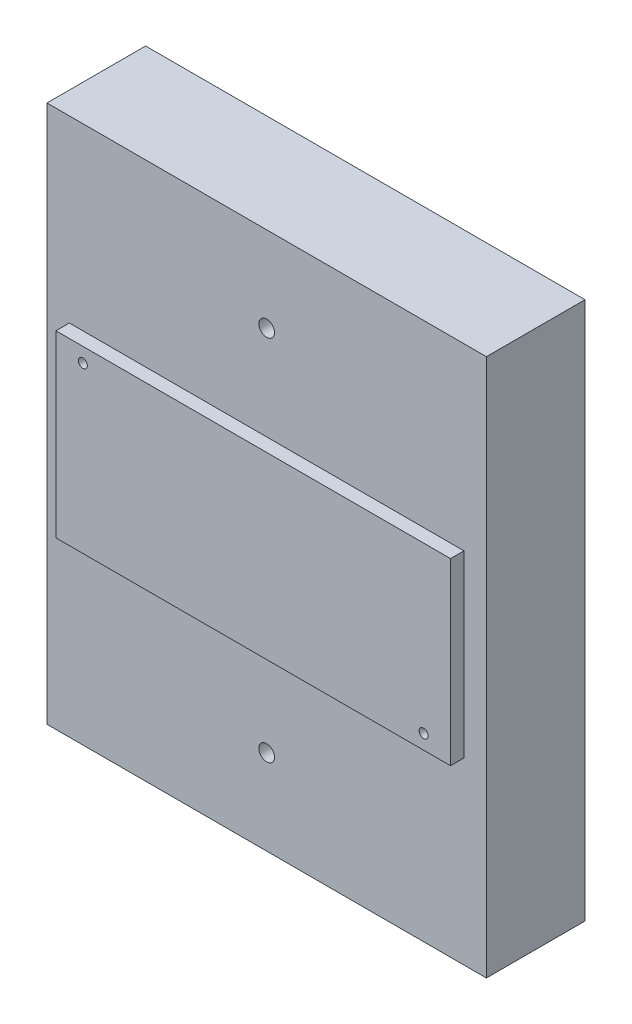
ISO-10303-21;
HEADER;
FILE_DESCRIPTION(('STEP AP214'),'2;1');
FILE_NAME('part.step','',(''),(''),'','','');
FILE_SCHEMA(('AUTOMOTIVE_DESIGN { 1 0 10303 214 1 1 1 1 }'));
ENDSEC;
DATA;
#1=APPLICATION_CONTEXT('core data for automotive mechanical design processes');
#2=APPLICATION_PROTOCOL_DEFINITION('international standard','automotive_design',2000,#1);
#3=PRODUCT_CONTEXT('',#1,'mechanical');
#4=PRODUCT('Part','Part','',(#3));
#5=PRODUCT_RELATED_PRODUCT_CATEGORY('part','',(#4));
#6=PRODUCT_DEFINITION_FORMATION('','',#4);
#7=PRODUCT_DEFINITION_CONTEXT('part definition',#1,'design');
#8=PRODUCT_DEFINITION('design','',#6,#7);
#9=PRODUCT_DEFINITION_SHAPE('','',#8);
#10=(LENGTH_UNIT() NAMED_UNIT(*) SI_UNIT(.MILLI.,.METRE.));
#11=(NAMED_UNIT(*) PLANE_ANGLE_UNIT() SI_UNIT($,.RADIAN.));
#12=(NAMED_UNIT(*) SI_UNIT($,.STERADIAN.) SOLID_ANGLE_UNIT());
#13=UNCERTAINTY_MEASURE_WITH_UNIT(LENGTH_MEASURE(1.E-05),#10,'distance_accuracy_value','');
#14=(GEOMETRIC_REPRESENTATION_CONTEXT(3) GLOBAL_UNCERTAINTY_ASSIGNED_CONTEXT((#13)) GLOBAL_UNIT_ASSIGNED_CONTEXT((#10,
#11,#12)) REPRESENTATION_CONTEXT('',''));
#15=CARTESIAN_POINT('',(0.,0.,0.));
#16=DIRECTION('',(0.,0.,1.));
#17=DIRECTION('',(1.,0.,0.));
#18=AXIS2_PLACEMENT_3D('',#15,#16,#17);
#19=CARTESIAN_POINT('',(0.,0.,22.));
#20=DIRECTION('',(0.,0.,1.));
#21=DIRECTION('',(1.,0.,0.));
#22=AXIS2_PLACEMENT_3D('',#19,#20,#21);
#23=PLANE('',#22);
#24=DIRECTION('',(0.,-1.,0.));
#25=VECTOR('',#24,1.);
#26=CARTESIAN_POINT('',(44.0000000000001,0.,22.));
#27=LINE('',#26,#25);
#28=CARTESIAN_POINT('',(44.0000000000001,20.,22.));
#29=VERTEX_POINT('',#28);
#30=CARTESIAN_POINT('',(44.0000000000001,-19.9999999999997,22.));
#31=VERTEX_POINT('',#30);
#32=EDGE_CURVE('E148',#29,#31,#27,.T.);
#33=ORIENTED_EDGE('',*,*,#32,.T.);
#34=DIRECTION('',(-1.,0.,0.));
#35=VECTOR('',#34,1.);
#36=CARTESIAN_POINT('',(0.,-19.9999999999999,22.));
#37=LINE('',#36,#35);
#38=CARTESIAN_POINT('',(-43.9999999999999,-20.,22.));
#39=VERTEX_POINT('',#38);
#40=EDGE_CURVE('E135',#31,#39,#37,.T.);
#41=ORIENTED_EDGE('',*,*,#40,.T.);
#42=DIRECTION('',(0.,1.,0.));
#43=VECTOR('',#42,1.);
#44=CARTESIAN_POINT('',(-44.,-1.45022882591661E-13,22.));
#45=LINE('',#44,#43);
#46=CARTESIAN_POINT('',(-44.0000000000001,20.,22.));
#47=VERTEX_POINT('',#46);
#48=EDGE_CURVE('E136',#39,#47,#45,.T.);
#49=ORIENTED_EDGE('',*,*,#48,.T.);
#50=DIRECTION('',(1.,0.,0.));
#51=VECTOR('',#50,1.);
#52=CARTESIAN_POINT('',(0.,20.,22.));
#53=LINE('',#52,#51);
#54=EDGE_CURVE('E139',#47,#29,#53,.T.);
#55=ORIENTED_EDGE('',*,*,#54,.T.);
#56=EDGE_LOOP('',(#33,#41,#49,#55));
#57=FACE_BOUND('',#56,.T.);
#58=CARTESIAN_POINT('',(0.,41.,22.));
#59=DIRECTION('',(0.,0.,1.));
#60=DIRECTION('',(1.,0.,0.));
#61=AXIS2_PLACEMENT_3D('',#58,#59,#60);
#62=CIRCLE('',#61,1.75);
#63=CARTESIAN_POINT('',(1.75000000000001,41.,22.));
#64=VERTEX_POINT('',#63);
#65=EDGE_CURVE('E158',#64,#64,#62,.T.);
#66=ORIENTED_EDGE('',*,*,#65,.F.);
#67=EDGE_LOOP('',(#66));
#68=FACE_BOUND('',#67,.T.);
#69=DIRECTION('',(0.,-1.,0.));
#70=VECTOR('',#69,1.);
#71=CARTESIAN_POINT('',(-49.,60.,22.));
#72=LINE('',#71,#70);
#73=CARTESIAN_POINT('',(-49.,60.,22.));
#74=VERTEX_POINT('',#73);
#75=CARTESIAN_POINT('',(-49.,-60.,22.));
#76=VERTEX_POINT('',#75);
#77=EDGE_CURVE('E164',#74,#76,#72,.T.);
#78=ORIENTED_EDGE('',*,*,#77,.T.);
#79=DIRECTION('',(1.,0.,0.));
#80=VECTOR('',#79,1.);
#81=CARTESIAN_POINT('',(-49.,-60.,22.));
#82=LINE('',#81,#80);
#83=CARTESIAN_POINT('',(49.,-60.,22.));
#84=VERTEX_POINT('',#83);
#85=EDGE_CURVE('E88',#76,#84,#82,.T.);
#86=ORIENTED_EDGE('',*,*,#85,.T.);
#87=DIRECTION('',(0.,1.,0.));
#88=VECTOR('',#87,1.);
#89=CARTESIAN_POINT('',(49.,60.,22.));
#90=LINE('',#89,#88);
#91=CARTESIAN_POINT('',(49.,60.,22.));
#92=VERTEX_POINT('',#91);
#93=EDGE_CURVE('E167',#84,#92,#90,.T.);
#94=ORIENTED_EDGE('',*,*,#93,.T.);
#95=DIRECTION('',(-1.,0.,0.));
#96=VECTOR('',#95,1.);
#97=CARTESIAN_POINT('',(-49.,60.,22.));
#98=LINE('',#97,#96);
#99=EDGE_CURVE('E59',#92,#74,#98,.T.);
#100=ORIENTED_EDGE('',*,*,#99,.T.);
#101=EDGE_LOOP('',(#78,#86,#94,#100));
#102=FACE_BOUND('',#101,.T.);
#103=CARTESIAN_POINT('',(0.,-41.,22.));
#104=DIRECTION('',(0.,0.,1.));
#105=DIRECTION('',(1.,0.,0.));
#106=AXIS2_PLACEMENT_3D('',#103,#104,#105);
#107=CIRCLE('',#106,1.75);
#108=CARTESIAN_POINT('',(1.75000000000001,-41.,22.));
#109=VERTEX_POINT('',#108);
#110=EDGE_CURVE('E152',#109,#109,#107,.T.);
#111=ORIENTED_EDGE('',*,*,#110,.F.);
#112=EDGE_LOOP('',(#111));
#113=FACE_BOUND('',#112,.T.);
#114=ADVANCED_FACE('F33',(#57,#68,#102,#113),#23,.T.);
#115=CARTESIAN_POINT('',(0.,0.,0.));
#116=DIRECTION('',(0.,0.,1.));
#117=DIRECTION('',(1.,0.,0.));
#118=AXIS2_PLACEMENT_3D('',#115,#116,#117);
#119=PLANE('',#118);
#120=DIRECTION('',(0.,-1.,0.));
#121=VECTOR('',#120,1.);
#122=CARTESIAN_POINT('',(-49.,60.,0.));
#123=LINE('',#122,#121);
#124=CARTESIAN_POINT('',(-49.,60.,0.));
#125=VERTEX_POINT('',#124);
#126=CARTESIAN_POINT('',(-49.,-60.,0.));
#127=VERTEX_POINT('',#126);
#128=EDGE_CURVE('E161',#125,#127,#123,.T.);
#129=ORIENTED_EDGE('',*,*,#128,.F.);
#130=DIRECTION('',(-1.,0.,0.));
#131=VECTOR('',#130,1.);
#132=CARTESIAN_POINT('',(-49.,60.,0.));
#133=LINE('',#132,#131);
#134=CARTESIAN_POINT('',(49.,60.,0.));
#135=VERTEX_POINT('',#134);
#136=EDGE_CURVE('E80',#135,#125,#133,.T.);
#137=ORIENTED_EDGE('',*,*,#136,.F.);
#138=DIRECTION('',(0.,1.,0.));
#139=VECTOR('',#138,1.);
#140=CARTESIAN_POINT('',(49.,60.,0.));
#141=LINE('',#140,#139);
#142=CARTESIAN_POINT('',(49.,-60.,0.));
#143=VERTEX_POINT('',#142);
#144=EDGE_CURVE('E175',#143,#135,#141,.T.);
#145=ORIENTED_EDGE('',*,*,#144,.F.);
#146=DIRECTION('',(1.,0.,0.));
#147=VECTOR('',#146,1.);
#148=CARTESIAN_POINT('',(-49.,-60.,0.));
#149=LINE('',#148,#147);
#150=EDGE_CURVE('E173',#127,#143,#149,.T.);
#151=ORIENTED_EDGE('',*,*,#150,.F.);
#152=EDGE_LOOP('',(#129,#137,#145,#151));
#153=FACE_BOUND('',#152,.T.);
#154=CARTESIAN_POINT('',(0.,41.,0.));
#155=DIRECTION('',(0.,0.,1.));
#156=DIRECTION('',(1.,0.,0.));
#157=AXIS2_PLACEMENT_3D('',#154,#155,#156);
#158=CIRCLE('',#157,1.75);
#159=CARTESIAN_POINT('',(1.75000000000001,41.,0.));
#160=VERTEX_POINT('',#159);
#161=EDGE_CURVE('E155',#160,#160,#158,.T.);
#162=ORIENTED_EDGE('',*,*,#161,.T.);
#163=EDGE_LOOP('',(#162));
#164=FACE_BOUND('',#163,.T.);
#165=CARTESIAN_POINT('',(0.,-41.,0.));
#166=DIRECTION('',(0.,0.,1.));
#167=DIRECTION('',(1.,0.,0.));
#168=AXIS2_PLACEMENT_3D('',#165,#166,#167);
#169=CIRCLE('',#168,1.75);
#170=CARTESIAN_POINT('',(1.75000000000001,-41.,0.));
#171=VERTEX_POINT('',#170);
#172=EDGE_CURVE('E151',#171,#171,#169,.T.);
#173=ORIENTED_EDGE('',*,*,#172,.T.);
#174=EDGE_LOOP('',(#173));
#175=FACE_BOUND('',#174,.T.);
#176=ADVANCED_FACE('F191',(#153,#164,#175),#119,.F.);
#177=CARTESIAN_POINT('',(-49.,60.,22.));
#178=DIRECTION('',(1.,0.,0.));
#179=DIRECTION('',(0.,0.,-1.));
#180=AXIS2_PLACEMENT_3D('',#177,#178,#179);
#181=PLANE('',#180);
#182=ORIENTED_EDGE('',*,*,#128,.T.);
#183=DIRECTION('',(0.,0.,-1.));
#184=VECTOR('',#183,1.);
#185=CARTESIAN_POINT('',(-49.,-60.,22.));
#186=LINE('',#185,#184);
#187=EDGE_CURVE('E37',#76,#127,#186,.T.);
#188=ORIENTED_EDGE('',*,*,#187,.F.);
#189=ORIENTED_EDGE('',*,*,#77,.F.);
#190=DIRECTION('',(0.,0.,-1.));
#191=VECTOR('',#190,1.);
#192=CARTESIAN_POINT('',(-49.,60.,22.));
#193=LINE('',#192,#191);
#194=EDGE_CURVE('E170',#74,#125,#193,.T.);
#195=ORIENTED_EDGE('',*,*,#194,.T.);
#196=EDGE_LOOP('',(#182,#188,#189,#195));
#197=FACE_BOUND('',#196,.T.);
#198=ADVANCED_FACE('F35',(#197),#181,.F.);
#199=CARTESIAN_POINT('',(-49.,-60.,22.));
#200=DIRECTION('',(0.,1.,0.));
#201=DIRECTION('',(0.,0.,1.));
#202=AXIS2_PLACEMENT_3D('',#199,#200,#201);
#203=PLANE('',#202);
#204=ORIENTED_EDGE('',*,*,#150,.T.);
#205=DIRECTION('',(0.,0.,-1.));
#206=VECTOR('',#205,1.);
#207=CARTESIAN_POINT('',(49.,-60.,22.));
#208=LINE('',#207,#206);
#209=EDGE_CURVE('E180',#84,#143,#208,.T.);
#210=ORIENTED_EDGE('',*,*,#209,.F.);
#211=ORIENTED_EDGE('',*,*,#85,.F.);
#212=ORIENTED_EDGE('',*,*,#187,.T.);
#213=EDGE_LOOP('',(#204,#210,#211,#212));
#214=FACE_BOUND('',#213,.T.);
#215=ADVANCED_FACE('F186',(#214),#203,.F.);
#216=CARTESIAN_POINT('',(49.,60.,22.));
#217=DIRECTION('',(-1.,0.,0.));
#218=DIRECTION('',(0.,0.,1.));
#219=AXIS2_PLACEMENT_3D('',#216,#217,#218);
#220=PLANE('',#219);
#221=ORIENTED_EDGE('',*,*,#144,.T.);
#222=DIRECTION('',(0.,0.,-1.));
#223=VECTOR('',#222,1.);
#224=CARTESIAN_POINT('',(49.,60.,22.));
#225=LINE('',#224,#223);
#226=EDGE_CURVE('E179',#92,#135,#225,.T.);
#227=ORIENTED_EDGE('',*,*,#226,.F.);
#228=ORIENTED_EDGE('',*,*,#93,.F.);
#229=ORIENTED_EDGE('',*,*,#209,.T.);
#230=EDGE_LOOP('',(#221,#227,#228,#229));
#231=FACE_BOUND('',#230,.T.);
#232=ADVANCED_FACE('F194',(#231),#220,.F.);
#233=CARTESIAN_POINT('',(-49.,60.,22.));
#234=DIRECTION('',(0.,-1.,0.));
#235=DIRECTION('',(0.,0.,-1.));
#236=AXIS2_PLACEMENT_3D('',#233,#234,#235);
#237=PLANE('',#236);
#238=ORIENTED_EDGE('',*,*,#136,.T.);
#239=ORIENTED_EDGE('',*,*,#194,.F.);
#240=ORIENTED_EDGE('',*,*,#99,.F.);
#241=ORIENTED_EDGE('',*,*,#226,.T.);
#242=EDGE_LOOP('',(#238,#239,#240,#241));
#243=FACE_BOUND('',#242,.T.);
#244=ADVANCED_FACE('F195',(#243),#237,.F.);
#245=CARTESIAN_POINT('',(0.,41.,22.));
#246=DIRECTION('',(0.,0.,-1.));
#247=DIRECTION('',(-1.,0.,0.));
#248=AXIS2_PLACEMENT_3D('',#245,#246,#247);
#249=CYLINDRICAL_SURFACE('',#248,1.75);
#250=ORIENTED_EDGE('',*,*,#65,.T.);
#251=EDGE_LOOP('',(#250));
#252=FACE_BOUND('',#251,.T.);
#253=ORIENTED_EDGE('',*,*,#161,.F.);
#254=EDGE_LOOP('',(#253));
#255=FACE_BOUND('',#254,.T.);
#256=ADVANCED_FACE('F207',(#252,#255),#249,.F.);
#257=CARTESIAN_POINT('',(0.,-41.,22.));
#258=DIRECTION('',(0.,0.,-1.));
#259=DIRECTION('',(-1.,0.,0.));
#260=AXIS2_PLACEMENT_3D('',#257,#258,#259);
#261=CYLINDRICAL_SURFACE('',#260,1.75);
#262=ORIENTED_EDGE('',*,*,#110,.T.);
#263=EDGE_LOOP('',(#262));
#264=FACE_BOUND('',#263,.T.);
#265=ORIENTED_EDGE('',*,*,#172,.F.);
#266=EDGE_LOOP('',(#265));
#267=FACE_BOUND('',#266,.T.);
#268=ADVANCED_FACE('F204',(#264,#267),#261,.F.);
#269=CARTESIAN_POINT('',(0.,0.,25.));
#270=DIRECTION('',(0.,0.,1.));
#271=DIRECTION('',(1.,0.,0.));
#272=AXIS2_PLACEMENT_3D('',#269,#270,#271);
#273=PLANE('',#272);
#274=CARTESIAN_POINT('',(-38.,16.75,25.));
#275=DIRECTION('',(0.,0.,1.));
#276=DIRECTION('',(1.,0.,0.));
#277=AXIS2_PLACEMENT_3D('',#274,#275,#276);
#278=CIRCLE('',#277,0.999999999999998);
#279=CARTESIAN_POINT('',(-37.,16.75,25.));
#280=VERTEX_POINT('',#279);
#281=EDGE_CURVE('E131',#280,#280,#278,.T.);
#282=ORIENTED_EDGE('',*,*,#281,.F.);
#283=EDGE_LOOP('',(#282));
#284=FACE_BOUND('',#283,.T.);
#285=DIRECTION('',(1.,0.,0.));
#286=VECTOR('',#285,1.);
#287=CARTESIAN_POINT('',(-43.9999999999999,-20.,25.));
#288=LINE('',#287,#286);
#289=CARTESIAN_POINT('',(-43.9999999999999,-20.,25.));
#290=VERTEX_POINT('',#289);
#291=CARTESIAN_POINT('',(44.0000000000001,-19.9999999999997,25.));
#292=VERTEX_POINT('',#291);
#293=EDGE_CURVE('E122',#290,#292,#288,.T.);
#294=ORIENTED_EDGE('',*,*,#293,.T.);
#295=DIRECTION('',(0.,1.,0.));
#296=VECTOR('',#295,1.);
#297=CARTESIAN_POINT('',(44.0000000000001,-19.9999999999997,25.));
#298=LINE('',#297,#296);
#299=CARTESIAN_POINT('',(44.0000000000001,20.,25.));
#300=VERTEX_POINT('',#299);
#301=EDGE_CURVE('E111',#292,#300,#298,.T.);
#302=ORIENTED_EDGE('',*,*,#301,.T.);
#303=DIRECTION('',(-1.,0.,0.));
#304=VECTOR('',#303,1.);
#305=CARTESIAN_POINT('',(-44.,20.,25.));
#306=LINE('',#305,#304);
#307=CARTESIAN_POINT('',(-44.,20.,25.));
#308=VERTEX_POINT('',#307);
#309=EDGE_CURVE('E121',#300,#308,#306,.T.);
#310=ORIENTED_EDGE('',*,*,#309,.T.);
#311=DIRECTION('',(0.,-1.,0.));
#312=VECTOR('',#311,1.);
#313=CARTESIAN_POINT('',(-43.9999999999999,-20.,25.));
#314=LINE('',#313,#312);
#315=EDGE_CURVE('E127',#308,#290,#314,.T.);
#316=ORIENTED_EDGE('',*,*,#315,.T.);
#317=EDGE_LOOP('',(#294,#302,#310,#316));
#318=FACE_BOUND('',#317,.T.);
#319=CARTESIAN_POINT('',(38.,-16.75,25.));
#320=DIRECTION('',(0.,0.,1.));
#321=DIRECTION('',(1.,0.,0.));
#322=AXIS2_PLACEMENT_3D('',#319,#320,#321);
#323=CIRCLE('',#322,0.999999999999998);
#324=CARTESIAN_POINT('',(39.,-16.75,25.));
#325=VERTEX_POINT('',#324);
#326=EDGE_CURVE('E354',#325,#325,#323,.T.);
#327=ORIENTED_EDGE('',*,*,#326,.F.);
#328=EDGE_LOOP('',(#327));
#329=FACE_BOUND('',#328,.T.);
#330=ADVANCED_FACE('F125',(#284,#318,#329),#273,.T.);
#331=CARTESIAN_POINT('',(-43.9999999999999,-20.,25.));
#332=DIRECTION('',(0.,1.,0.));
#333=DIRECTION('',(-1.,0.,0.));
#334=AXIS2_PLACEMENT_3D('',#331,#332,#333);
#335=PLANE('',#334);
#336=ORIENTED_EDGE('',*,*,#40,.F.);
#337=DIRECTION('',(0.,0.,-1.));
#338=VECTOR('',#337,1.);
#339=CARTESIAN_POINT('',(44.0000000000001,-19.9999999999997,25.));
#340=LINE('',#339,#338);
#341=EDGE_CURVE('E115',#292,#31,#340,.T.);
#342=ORIENTED_EDGE('',*,*,#341,.F.);
#343=ORIENTED_EDGE('',*,*,#293,.F.);
#344=DIRECTION('',(0.,0.,-1.));
#345=VECTOR('',#344,1.);
#346=CARTESIAN_POINT('',(-43.9999999999999,-20.,25.));
#347=LINE('',#346,#345);
#348=EDGE_CURVE('E361',#290,#39,#347,.T.);
#349=ORIENTED_EDGE('',*,*,#348,.T.);
#350=EDGE_LOOP('',(#336,#342,#343,#349));
#351=FACE_BOUND('',#350,.T.);
#352=ADVANCED_FACE('F133',(#351),#335,.F.);
#353=CARTESIAN_POINT('',(44.0000000000001,-19.9999999999997,25.));
#354=DIRECTION('',(-1.,0.,0.));
#355=DIRECTION('',(0.,-1.,0.));
#356=AXIS2_PLACEMENT_3D('',#353,#354,#355);
#357=PLANE('',#356);
#358=ORIENTED_EDGE('',*,*,#32,.F.);
#359=DIRECTION('',(0.,0.,-1.));
#360=VECTOR('',#359,1.);
#361=CARTESIAN_POINT('',(44.0000000000001,20.,25.));
#362=LINE('',#361,#360);
#363=EDGE_CURVE('E118',#300,#29,#362,.T.);
#364=ORIENTED_EDGE('',*,*,#363,.F.);
#365=ORIENTED_EDGE('',*,*,#301,.F.);
#366=ORIENTED_EDGE('',*,*,#341,.T.);
#367=EDGE_LOOP('',(#358,#364,#365,#366));
#368=FACE_BOUND('',#367,.T.);
#369=ADVANCED_FACE('F113',(#368),#357,.F.);
#370=CARTESIAN_POINT('',(-44.,20.,25.));
#371=DIRECTION('',(0.,-1.,0.));
#372=DIRECTION('',(1.,0.,0.));
#373=AXIS2_PLACEMENT_3D('',#370,#371,#372);
#374=PLANE('',#373);
#375=ORIENTED_EDGE('',*,*,#54,.F.);
#376=DIRECTION('',(0.,0.,-1.));
#377=VECTOR('',#376,1.);
#378=CARTESIAN_POINT('',(-44.,20.,25.));
#379=LINE('',#378,#377);
#380=EDGE_CURVE('E50',#308,#47,#379,.T.);
#381=ORIENTED_EDGE('',*,*,#380,.F.);
#382=ORIENTED_EDGE('',*,*,#309,.F.);
#383=ORIENTED_EDGE('',*,*,#363,.T.);
#384=EDGE_LOOP('',(#375,#381,#382,#383));
#385=FACE_BOUND('',#384,.T.);
#386=ADVANCED_FACE('F264',(#385),#374,.F.);
#387=CARTESIAN_POINT('',(-43.9999999999999,-20.,25.));
#388=DIRECTION('',(1.,0.,0.));
#389=DIRECTION('',(0.,1.,0.));
#390=AXIS2_PLACEMENT_3D('',#387,#388,#389);
#391=PLANE('',#390);
#392=ORIENTED_EDGE('',*,*,#48,.F.);
#393=ORIENTED_EDGE('',*,*,#348,.F.);
#394=ORIENTED_EDGE('',*,*,#315,.F.);
#395=ORIENTED_EDGE('',*,*,#380,.T.);
#396=EDGE_LOOP('',(#392,#393,#394,#395));
#397=FACE_BOUND('',#396,.T.);
#398=ADVANCED_FACE('F271',(#397),#391,.F.);
#399=CARTESIAN_POINT('',(-38.,16.75,25.));
#400=DIRECTION('',(0.,0.,-1.));
#401=DIRECTION('',(-1.,0.,0.));
#402=AXIS2_PLACEMENT_3D('',#399,#400,#401);
#403=CYLINDRICAL_SURFACE('',#402,0.999999999999998);
#404=CARTESIAN_POINT('',(-38.,16.75,22.));
#405=DIRECTION('',(0.,0.,1.));
#406=DIRECTION('',(1.,0.,0.));
#407=AXIS2_PLACEMENT_3D('',#404,#405,#406);
#408=CIRCLE('',#407,0.999999999999998);
#409=CARTESIAN_POINT('',(-37.,16.75,22.));
#410=VERTEX_POINT('',#409);
#411=EDGE_CURVE('E11',#410,#410,#408,.F.);
#412=ORIENTED_EDGE('',*,*,#411,.T.);
#413=EDGE_LOOP('',(#412));
#414=FACE_BOUND('',#413,.T.);
#415=ORIENTED_EDGE('',*,*,#281,.T.);
#416=EDGE_LOOP('',(#415));
#417=FACE_BOUND('',#416,.T.);
#418=ADVANCED_FACE('F279',(#414,#417),#403,.F.);
#419=CARTESIAN_POINT('',(38.,-16.75,25.));
#420=DIRECTION('',(0.,0.,-1.));
#421=DIRECTION('',(-1.,0.,0.));
#422=AXIS2_PLACEMENT_3D('',#419,#420,#421);
#423=CYLINDRICAL_SURFACE('',#422,0.999999999999998);
#424=CARTESIAN_POINT('',(38.,-16.75,22.));
#425=DIRECTION('',(0.,0.,1.));
#426=DIRECTION('',(1.,0.,0.));
#427=AXIS2_PLACEMENT_3D('',#424,#425,#426);
#428=CIRCLE('',#427,0.999999999999998);
#429=CARTESIAN_POINT('',(39.,-16.75,22.));
#430=VERTEX_POINT('',#429);
#431=EDGE_CURVE('E42',#430,#430,#428,.F.);
#432=ORIENTED_EDGE('',*,*,#431,.T.);
#433=EDGE_LOOP('',(#432));
#434=FACE_BOUND('',#433,.T.);
#435=ORIENTED_EDGE('',*,*,#326,.T.);
#436=EDGE_LOOP('',(#435));
#437=FACE_BOUND('',#436,.T.);
#438=ADVANCED_FACE('F286',(#434,#437),#423,.F.);
#439=ORIENTED_EDGE('',*,*,#431,.F.);
#440=EDGE_LOOP('',(#439));
#441=FACE_BOUND('',#440,.T.);
#442=ADVANCED_FACE('F201',(#441),#23,.T.);
#443=ORIENTED_EDGE('',*,*,#411,.F.);
#444=EDGE_LOOP('',(#443));
#445=FACE_BOUND('',#444,.T.);
#446=ADVANCED_FACE('F200',(#445),#23,.T.);
#447=CLOSED_SHELL('',(#114,#176,#198,#215,#232,#244,#256,#268,#330,#352,#369,#386,#398,#418,
#438,#442,#446));
#448=MANIFOLD_SOLID_BREP('B2',#447);
#449=ADVANCED_BREP_SHAPE_REPRESENTATION('',(#18,#448),#14);
#450=SHAPE_DEFINITION_REPRESENTATION(#9,#449);
ENDSEC;
END-ISO-10303-21;
